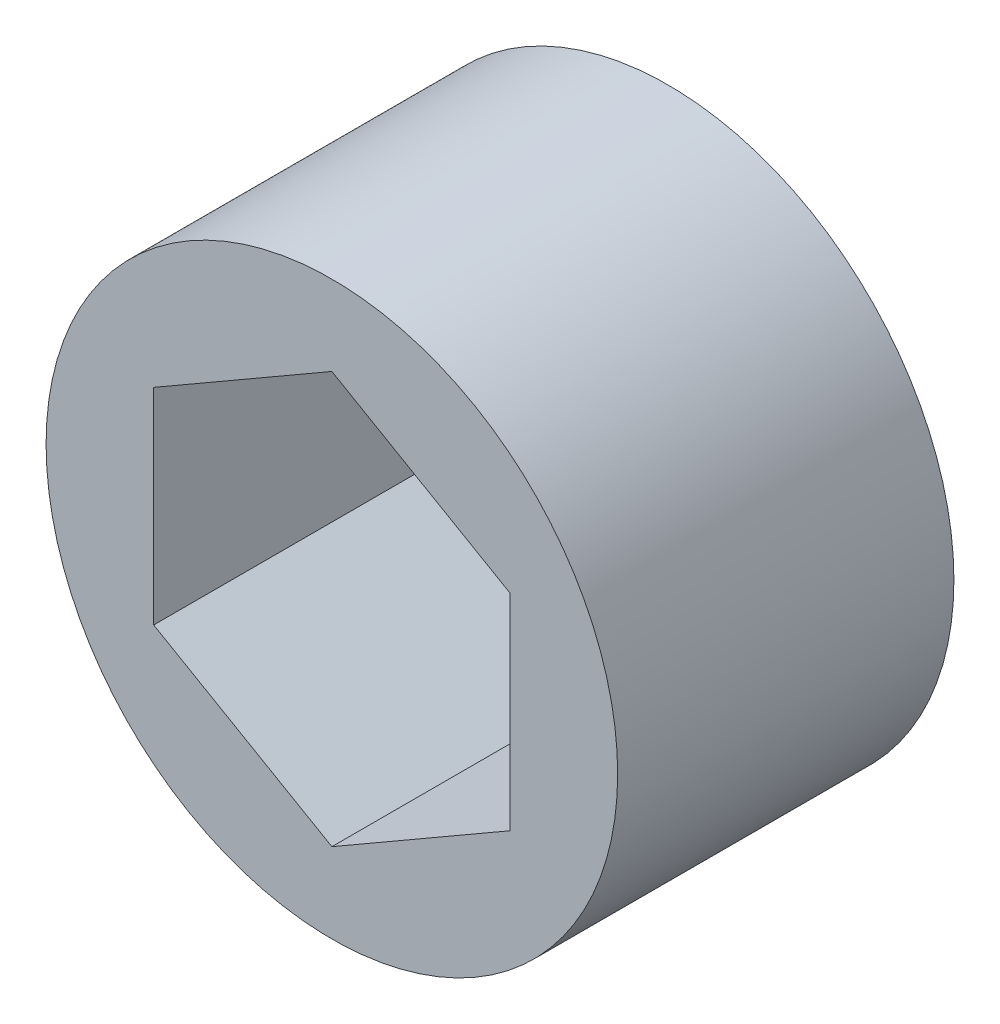
ISO-10303-21;
HEADER;
FILE_DESCRIPTION(('STEP AP214'),'2;1');
FILE_NAME('part.step','',(''),(''),'','','');
FILE_SCHEMA(('AUTOMOTIVE_DESIGN { 1 0 10303 214 1 1 1 1 }'));
ENDSEC;
DATA;
#1=APPLICATION_CONTEXT('core data for automotive mechanical design processes');
#2=APPLICATION_PROTOCOL_DEFINITION('international standard','automotive_design',2000,#1);
#3=PRODUCT_CONTEXT('',#1,'mechanical');
#4=PRODUCT('Part','Part','',(#3));
#5=PRODUCT_RELATED_PRODUCT_CATEGORY('part','',(#4));
#6=PRODUCT_DEFINITION_FORMATION('','',#4);
#7=PRODUCT_DEFINITION_CONTEXT('part definition',#1,'design');
#8=PRODUCT_DEFINITION('design','',#6,#7);
#9=PRODUCT_DEFINITION_SHAPE('','',#8);
#10=(LENGTH_UNIT() NAMED_UNIT(*) SI_UNIT(.MILLI.,.METRE.));
#11=(NAMED_UNIT(*) PLANE_ANGLE_UNIT() SI_UNIT($,.RADIAN.));
#12=(NAMED_UNIT(*) SI_UNIT($,.STERADIAN.) SOLID_ANGLE_UNIT());
#13=UNCERTAINTY_MEASURE_WITH_UNIT(LENGTH_MEASURE(1.E-05),#10,'distance_accuracy_value','');
#14=(GEOMETRIC_REPRESENTATION_CONTEXT(3) GLOBAL_UNCERTAINTY_ASSIGNED_CONTEXT((#13)) GLOBAL_UNIT_ASSIGNED_CONTEXT((#10,
#11,#12)) REPRESENTATION_CONTEXT('',''));
#15=CARTESIAN_POINT('',(0.,0.,0.));
#16=DIRECTION('',(0.,0.,1.));
#17=DIRECTION('',(1.,0.,0.));
#18=AXIS2_PLACEMENT_3D('',#15,#16,#17);
#19=CARTESIAN_POINT('',(0.,0.,12.7));
#20=DIRECTION('',(0.,0.,1.));
#21=DIRECTION('',(1.,0.,0.));
#22=AXIS2_PLACEMENT_3D('',#19,#20,#21);
#23=PLANE('',#22);
#24=CARTESIAN_POINT('',(0.,0.,12.7));
#25=DIRECTION('',(0.,0.,1.));
#26=DIRECTION('',(1.,0.,0.));
#27=AXIS2_PLACEMENT_3D('',#24,#25,#26);
#28=CIRCLE('',#27,10.795);
#29=CARTESIAN_POINT('',(10.795,0.,12.7));
#30=VERTEX_POINT('',#29);
#31=EDGE_CURVE('E11',#30,#30,#28,.T.);
#32=ORIENTED_EDGE('',*,*,#31,.T.);
#33=EDGE_LOOP('',(#32));
#34=FACE_BOUND('',#33,.T.);
#35=DIRECTION('',(-0.866025403784439,-0.5,0.));
#36=VECTOR('',#35,1.);
#37=CARTESIAN_POINT('',(0.,7.77228932383074,12.7));
#38=LINE('',#37,#36);
#39=CARTESIAN_POINT('',(0.,7.77228932383074,12.7));
#40=VERTEX_POINT('',#39);
#41=CARTESIAN_POINT('',(-6.731,3.88614466191537,12.7));
#42=VERTEX_POINT('',#41);
#43=EDGE_CURVE('E98',#40,#42,#38,.T.);
#44=ORIENTED_EDGE('',*,*,#43,.F.);
#45=DIRECTION('',(-0.866025403784439,0.5,0.));
#46=VECTOR('',#45,1.);
#47=CARTESIAN_POINT('',(6.731,3.88614466191537,12.7));
#48=LINE('',#47,#46);
#49=CARTESIAN_POINT('',(6.731,3.88614466191537,12.7));
#50=VERTEX_POINT('',#49);
#51=EDGE_CURVE('E90',#50,#40,#48,.T.);
#52=ORIENTED_EDGE('',*,*,#51,.F.);
#53=DIRECTION('',(0.,1.,0.));
#54=VECTOR('',#53,1.);
#55=CARTESIAN_POINT('',(6.731,-3.88614466191537,12.7));
#56=LINE('',#55,#54);
#57=CARTESIAN_POINT('',(6.731,-3.88614466191537,12.7));
#58=VERTEX_POINT('',#57);
#59=EDGE_CURVE('E118',#58,#50,#56,.T.);
#60=ORIENTED_EDGE('',*,*,#59,.F.);
#61=DIRECTION('',(0.866025403784439,0.5,0.));
#62=VECTOR('',#61,1.);
#63=CARTESIAN_POINT('',(0.,-7.77228932383074,12.7));
#64=LINE('',#63,#62);
#65=CARTESIAN_POINT('',(0.,-7.77228932383074,12.7));
#66=VERTEX_POINT('',#65);
#67=EDGE_CURVE('E116',#66,#58,#64,.T.);
#68=ORIENTED_EDGE('',*,*,#67,.F.);
#69=DIRECTION('',(0.866025403784439,-0.5,0.));
#70=VECTOR('',#69,1.);
#71=CARTESIAN_POINT('',(-6.731,-3.88614466191537,12.7));
#72=LINE('',#71,#70);
#73=CARTESIAN_POINT('',(-6.731,-3.88614466191537,12.7));
#74=VERTEX_POINT('',#73);
#75=EDGE_CURVE('E112',#74,#66,#72,.T.);
#76=ORIENTED_EDGE('',*,*,#75,.F.);
#77=DIRECTION('',(0.,-1.,0.));
#78=VECTOR('',#77,1.);
#79=CARTESIAN_POINT('',(-6.731,3.88614466191537,12.7));
#80=LINE('',#79,#78);
#81=EDGE_CURVE('E110',#42,#74,#80,.T.);
#82=ORIENTED_EDGE('',*,*,#81,.F.);
#83=EDGE_LOOP('',(#44,#52,#60,#68,#76,#82));
#84=FACE_BOUND('',#83,.T.);
#85=ADVANCED_FACE('F37',(#34,#84),#23,.T.);
#86=CARTESIAN_POINT('',(0.,0.,0.));
#87=DIRECTION('',(0.,0.,1.));
#88=DIRECTION('',(1.,0.,0.));
#89=AXIS2_PLACEMENT_3D('',#86,#87,#88);
#90=PLANE('',#89);
#91=CARTESIAN_POINT('',(0.,0.,0.));
#92=DIRECTION('',(0.,0.,1.));
#93=DIRECTION('',(1.,0.,0.));
#94=AXIS2_PLACEMENT_3D('',#91,#92,#93);
#95=CIRCLE('',#94,10.795);
#96=CARTESIAN_POINT('',(10.795,0.,0.));
#97=VERTEX_POINT('',#96);
#98=EDGE_CURVE('E41',#97,#97,#95,.T.);
#99=ORIENTED_EDGE('',*,*,#98,.F.);
#100=EDGE_LOOP('',(#99));
#101=FACE_BOUND('',#100,.T.);
#102=DIRECTION('',(-0.866025403784439,0.5,0.));
#103=VECTOR('',#102,1.);
#104=CARTESIAN_POINT('',(6.731,3.88614466191537,0.));
#105=LINE('',#104,#103);
#106=CARTESIAN_POINT('',(6.731,3.88614466191537,0.));
#107=VERTEX_POINT('',#106);
#108=CARTESIAN_POINT('',(0.,7.77228932383074,0.));
#109=VERTEX_POINT('',#108);
#110=EDGE_CURVE('E60',#107,#109,#105,.T.);
#111=ORIENTED_EDGE('',*,*,#110,.T.);
#112=DIRECTION('',(-0.866025403784439,-0.5,0.));
#113=VECTOR('',#112,1.);
#114=CARTESIAN_POINT('',(0.,7.77228932383074,0.));
#115=LINE('',#114,#113);
#116=CARTESIAN_POINT('',(-6.731,3.88614466191537,0.));
#117=VERTEX_POINT('',#116);
#118=EDGE_CURVE('E105',#109,#117,#115,.T.);
#119=ORIENTED_EDGE('',*,*,#118,.T.);
#120=DIRECTION('',(0.,-1.,0.));
#121=VECTOR('',#120,1.);
#122=CARTESIAN_POINT('',(-6.731,3.88614466191537,0.));
#123=LINE('',#122,#121);
#124=CARTESIAN_POINT('',(-6.731,-3.88614466191537,0.));
#125=VERTEX_POINT('',#124);
#126=EDGE_CURVE('E122',#117,#125,#123,.T.);
#127=ORIENTED_EDGE('',*,*,#126,.T.);
#128=DIRECTION('',(0.866025403784439,-0.5,0.));
#129=VECTOR('',#128,1.);
#130=CARTESIAN_POINT('',(-6.731,-3.88614466191537,0.));
#131=LINE('',#130,#129);
#132=CARTESIAN_POINT('',(0.,-7.77228932383074,0.));
#133=VERTEX_POINT('',#132);
#134=EDGE_CURVE('E125',#125,#133,#131,.T.);
#135=ORIENTED_EDGE('',*,*,#134,.T.);
#136=DIRECTION('',(0.866025403784439,0.5,0.));
#137=VECTOR('',#136,1.);
#138=CARTESIAN_POINT('',(0.,-7.77228932383074,0.));
#139=LINE('',#138,#137);
#140=CARTESIAN_POINT('',(6.731,-3.88614466191537,0.));
#141=VERTEX_POINT('',#140);
#142=EDGE_CURVE('E128',#133,#141,#139,.T.);
#143=ORIENTED_EDGE('',*,*,#142,.T.);
#144=DIRECTION('',(0.,1.,0.));
#145=VECTOR('',#144,1.);
#146=CARTESIAN_POINT('',(6.731,-3.88614466191537,0.));
#147=LINE('',#146,#145);
#148=EDGE_CURVE('E99',#141,#107,#147,.T.);
#149=ORIENTED_EDGE('',*,*,#148,.T.);
#150=EDGE_LOOP('',(#111,#119,#127,#135,#143,#149));
#151=FACE_BOUND('',#150,.T.);
#152=ADVANCED_FACE('F145',(#101,#151),#90,.F.);
#153=CARTESIAN_POINT('',(0.,0.,12.7));
#154=DIRECTION('',(0.,0.,-1.));
#155=DIRECTION('',(-1.,0.,0.));
#156=AXIS2_PLACEMENT_3D('',#153,#154,#155);
#157=CYLINDRICAL_SURFACE('',#156,10.795);
#158=ORIENTED_EDGE('',*,*,#31,.F.);
#159=EDGE_LOOP('',(#158));
#160=FACE_BOUND('',#159,.T.);
#161=ORIENTED_EDGE('',*,*,#98,.T.);
#162=EDGE_LOOP('',(#161));
#163=FACE_BOUND('',#162,.T.);
#164=ADVANCED_FACE('F39',(#160,#163),#157,.T.);
#165=CARTESIAN_POINT('',(6.731,3.88614466191537,12.7));
#166=DIRECTION('',(-0.5,-0.866025403784439,0.));
#167=DIRECTION('',(0.866025403784439,-0.5,0.));
#168=AXIS2_PLACEMENT_3D('',#165,#166,#167);
#169=PLANE('',#168);
#170=ORIENTED_EDGE('',*,*,#110,.F.);
#171=DIRECTION('',(0.,0.,-1.));
#172=VECTOR('',#171,1.);
#173=CARTESIAN_POINT('',(6.731,3.88614466191537,12.7));
#174=LINE('',#173,#172);
#175=EDGE_CURVE('E94',#50,#107,#174,.T.);
#176=ORIENTED_EDGE('',*,*,#175,.F.);
#177=ORIENTED_EDGE('',*,*,#51,.T.);
#178=DIRECTION('',(0.,0.,-1.));
#179=VECTOR('',#178,1.);
#180=CARTESIAN_POINT('',(0.,7.77228932383074,12.7));
#181=LINE('',#180,#179);
#182=EDGE_CURVE('E93',#40,#109,#181,.T.);
#183=ORIENTED_EDGE('',*,*,#182,.T.);
#184=EDGE_LOOP('',(#170,#176,#177,#183));
#185=FACE_BOUND('',#184,.T.);
#186=ADVANCED_FACE('F92',(#185),#169,.T.);
#187=CARTESIAN_POINT('',(0.,7.77228932383074,12.7));
#188=DIRECTION('',(0.5,-0.866025403784439,0.));
#189=DIRECTION('',(0.866025403784439,0.5,0.));
#190=AXIS2_PLACEMENT_3D('',#187,#188,#189);
#191=PLANE('',#190);
#192=ORIENTED_EDGE('',*,*,#118,.F.);
#193=ORIENTED_EDGE('',*,*,#182,.F.);
#194=ORIENTED_EDGE('',*,*,#43,.T.);
#195=DIRECTION('',(0.,0.,-1.));
#196=VECTOR('',#195,1.);
#197=CARTESIAN_POINT('',(-6.731,3.88614466191537,12.7));
#198=LINE('',#197,#196);
#199=EDGE_CURVE('E106',#42,#117,#198,.T.);
#200=ORIENTED_EDGE('',*,*,#199,.T.);
#201=EDGE_LOOP('',(#192,#193,#194,#200));
#202=FACE_BOUND('',#201,.T.);
#203=ADVANCED_FACE('F102',(#202),#191,.T.);
#204=CARTESIAN_POINT('',(-6.731,3.88614466191537,12.7));
#205=DIRECTION('',(1.,0.,0.));
#206=DIRECTION('',(0.,0.,-1.));
#207=AXIS2_PLACEMENT_3D('',#204,#205,#206);
#208=PLANE('',#207);
#209=ORIENTED_EDGE('',*,*,#126,.F.);
#210=ORIENTED_EDGE('',*,*,#199,.F.);
#211=ORIENTED_EDGE('',*,*,#81,.T.);
#212=DIRECTION('',(0.,0.,-1.));
#213=VECTOR('',#212,1.);
#214=CARTESIAN_POINT('',(-6.731,-3.88614466191537,12.7));
#215=LINE('',#214,#213);
#216=EDGE_CURVE('E137',#74,#125,#215,.T.);
#217=ORIENTED_EDGE('',*,*,#216,.T.);
#218=EDGE_LOOP('',(#209,#210,#211,#217));
#219=FACE_BOUND('',#218,.T.);
#220=ADVANCED_FACE('F141',(#219),#208,.T.);
#221=CARTESIAN_POINT('',(-6.731,-3.88614466191537,12.7));
#222=DIRECTION('',(0.5,0.866025403784438,0.));
#223=DIRECTION('',(-0.866025403784439,0.5,0.));
#224=AXIS2_PLACEMENT_3D('',#221,#222,#223);
#225=PLANE('',#224);
#226=ORIENTED_EDGE('',*,*,#134,.F.);
#227=ORIENTED_EDGE('',*,*,#216,.F.);
#228=ORIENTED_EDGE('',*,*,#75,.T.);
#229=DIRECTION('',(0.,0.,-1.));
#230=VECTOR('',#229,1.);
#231=CARTESIAN_POINT('',(0.,-7.77228932383074,12.7));
#232=LINE('',#231,#230);
#233=EDGE_CURVE('E135',#66,#133,#232,.T.);
#234=ORIENTED_EDGE('',*,*,#233,.T.);
#235=EDGE_LOOP('',(#226,#227,#228,#234));
#236=FACE_BOUND('',#235,.T.);
#237=ADVANCED_FACE('F153',(#236),#225,.T.);
#238=CARTESIAN_POINT('',(0.,-7.77228932383074,12.7));
#239=DIRECTION('',(-0.5,0.866025403784439,0.));
#240=DIRECTION('',(-0.866025403784439,-0.5,0.));
#241=AXIS2_PLACEMENT_3D('',#238,#239,#240);
#242=PLANE('',#241);
#243=ORIENTED_EDGE('',*,*,#142,.F.);
#244=ORIENTED_EDGE('',*,*,#233,.F.);
#245=ORIENTED_EDGE('',*,*,#67,.T.);
#246=DIRECTION('',(0.,0.,-1.));
#247=VECTOR('',#246,1.);
#248=CARTESIAN_POINT('',(6.731,-3.88614466191537,12.7));
#249=LINE('',#248,#247);
#250=EDGE_CURVE('E52',#58,#141,#249,.T.);
#251=ORIENTED_EDGE('',*,*,#250,.T.);
#252=EDGE_LOOP('',(#243,#244,#245,#251));
#253=FACE_BOUND('',#252,.T.);
#254=ADVANCED_FACE('F151',(#253),#242,.T.);
#255=CARTESIAN_POINT('',(6.731,-3.88614466191537,12.7));
#256=DIRECTION('',(-1.,0.,0.));
#257=DIRECTION('',(0.,-1.,0.));
#258=AXIS2_PLACEMENT_3D('',#255,#256,#257);
#259=PLANE('',#258);
#260=ORIENTED_EDGE('',*,*,#148,.F.);
#261=ORIENTED_EDGE('',*,*,#250,.F.);
#262=ORIENTED_EDGE('',*,*,#59,.T.);
#263=ORIENTED_EDGE('',*,*,#175,.T.);
#264=EDGE_LOOP('',(#260,#261,#262,#263));
#265=FACE_BOUND('',#264,.T.);
#266=ADVANCED_FACE('F147',(#265),#259,.T.);
#267=CLOSED_SHELL('',(#85,#152,#164,#186,#203,#220,#237,#254,#266));
#268=MANIFOLD_SOLID_BREP('B2',#267);
#269=ADVANCED_BREP_SHAPE_REPRESENTATION('',(#18,#268),#14);
#270=SHAPE_DEFINITION_REPRESENTATION(#9,#269);
ENDSEC;
END-ISO-10303-21;
